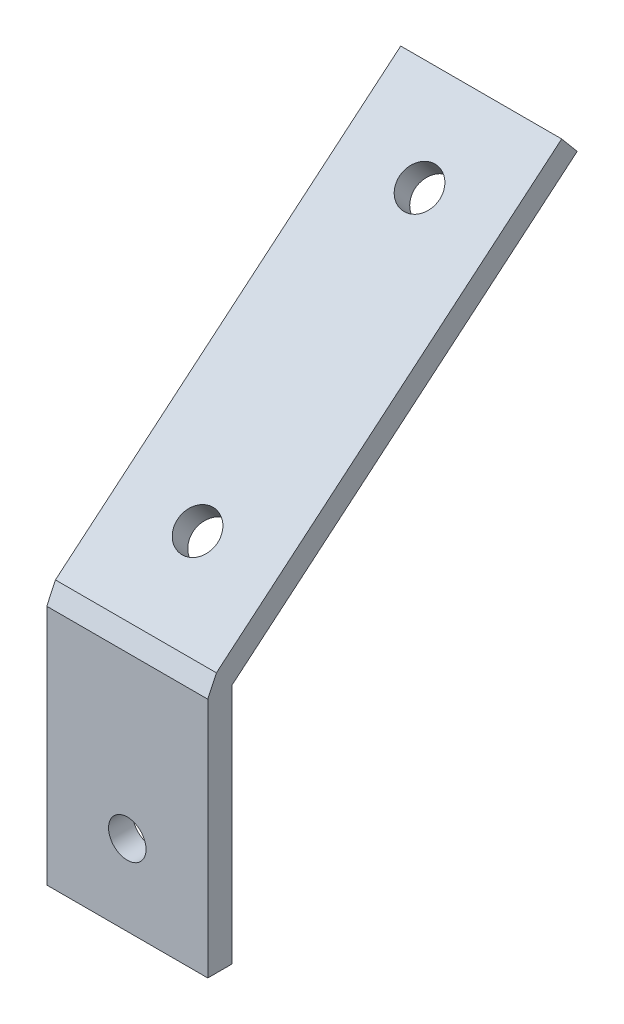
ISO-10303-21;
HEADER;
FILE_DESCRIPTION(('STEP AP214'),'2;1');
FILE_NAME('part.step','',(''),(''),'','','');
FILE_SCHEMA(('AUTOMOTIVE_DESIGN { 1 0 10303 214 1 1 1 1 }'));
ENDSEC;
DATA;
#1=APPLICATION_CONTEXT('core data for automotive mechanical design processes');
#2=APPLICATION_PROTOCOL_DEFINITION('international standard','automotive_design',2000,#1);
#3=PRODUCT_CONTEXT('',#1,'mechanical');
#4=PRODUCT('Part','Part','',(#3));
#5=PRODUCT_RELATED_PRODUCT_CATEGORY('part','',(#4));
#6=PRODUCT_DEFINITION_FORMATION('','',#4);
#7=PRODUCT_DEFINITION_CONTEXT('part definition',#1,'design');
#8=PRODUCT_DEFINITION('design','',#6,#7);
#9=PRODUCT_DEFINITION_SHAPE('','',#8);
#10=(LENGTH_UNIT() NAMED_UNIT(*) SI_UNIT(.MILLI.,.METRE.));
#11=(NAMED_UNIT(*) PLANE_ANGLE_UNIT() SI_UNIT($,.RADIAN.));
#12=(NAMED_UNIT(*) SI_UNIT($,.STERADIAN.) SOLID_ANGLE_UNIT());
#13=UNCERTAINTY_MEASURE_WITH_UNIT(LENGTH_MEASURE(1.E-05),#10,'distance_accuracy_value','');
#14=(GEOMETRIC_REPRESENTATION_CONTEXT(3) GLOBAL_UNCERTAINTY_ASSIGNED_CONTEXT((#13)) GLOBAL_UNIT_ASSIGNED_CONTEXT((#10,
#11,#12)) REPRESENTATION_CONTEXT('',''));
#15=CARTESIAN_POINT('',(0.,0.,0.));
#16=DIRECTION('',(0.,0.,1.));
#17=DIRECTION('',(1.,0.,0.));
#18=AXIS2_PLACEMENT_3D('',#15,#16,#17);
#19=CARTESIAN_POINT('',(20.,16.1275110354849,13.5325885616836));
#20=DIRECTION('',(0.,0.766044443118962,0.642787609686558));
#21=DIRECTION('',(0.,-0.642787609686558,0.766044443118962));
#22=AXIS2_PLACEMENT_3D('',#19,#20,#21);
#23=PLANE('',#22);
#24=CARTESIAN_POINT('',(10.,59.5682300455817,-38.2380443834723));
#25=DIRECTION('',(0.,-0.766044443118962,-0.642787609686558));
#26=DIRECTION('',(0.,0.642787609686558,-0.766044443118962));
#27=AXIS2_PLACEMENT_3D('',#24,#25,#26);
#28=CIRCLE('',#27,2.5);
#29=CARTESIAN_POINT('',(10.,61.1751990697981,-40.1531554912697));
#30=VERTEX_POINT('',#29);
#31=EDGE_CURVE('E133',#30,#30,#28,.T.);
#32=ORIENTED_EDGE('',*,*,#31,.F.);
#33=EDGE_LOOP('',(#32));
#34=FACE_BOUND('',#33,.T.);
#35=CARTESIAN_POINT('',(10.,36.4278760968656,-10.6604444311896));
#36=DIRECTION('',(0.,-0.766044443118962,-0.642787609686558));
#37=DIRECTION('',(0.,0.642787609686558,-0.766044443118962));
#38=AXIS2_PLACEMENT_3D('',#35,#36,#37);
#39=CIRCLE('',#38,2.5);
#40=CARTESIAN_POINT('',(10.,38.034845121082,-12.575555538987));
#41=VERTEX_POINT('',#40);
#42=EDGE_CURVE('E168',#41,#41,#39,.T.);
#43=ORIENTED_EDGE('',*,*,#42,.F.);
#44=EDGE_LOOP('',(#43));
#45=FACE_BOUND('',#44,.T.);
#46=DIRECTION('',(0.,0.642787609686558,-0.766044443118962));
#47=VECTOR('',#46,1.);
#48=CARTESIAN_POINT('',(0.,16.1275110354849,13.5325885616836));
#49=LINE('',#48,#47);
#50=CARTESIAN_POINT('',(0.,30.,-3.00000000000001));
#51=VERTEX_POINT('',#50);
#52=CARTESIAN_POINT('',(0.,65.9961061424472,-45.8984888146619));
#53=VERTEX_POINT('',#52);
#54=EDGE_CURVE('E129',#51,#53,#49,.T.);
#55=ORIENTED_EDGE('',*,*,#54,.T.);
#56=DIRECTION('',(-1.,0.,0.));
#57=VECTOR('',#56,1.);
#58=CARTESIAN_POINT('',(20.,65.9961061424472,-45.8984888146619));
#59=LINE('',#58,#57);
#60=CARTESIAN_POINT('',(20.,65.9961061424472,-45.8984888146619));
#61=VERTEX_POINT('',#60);
#62=EDGE_CURVE('E11',#61,#53,#59,.T.);
#63=ORIENTED_EDGE('',*,*,#62,.F.);
#64=DIRECTION('',(0.,0.642787609686558,-0.766044443118962));
#65=VECTOR('',#64,1.);
#66=CARTESIAN_POINT('',(20.,16.1275110354849,13.5325885616836));
#67=LINE('',#66,#65);
#68=CARTESIAN_POINT('',(20.,30.,-3.00000000000001));
#69=VERTEX_POINT('',#68);
#70=EDGE_CURVE('E145',#69,#61,#67,.T.);
#71=ORIENTED_EDGE('',*,*,#70,.F.);
#72=DIRECTION('',(-1.,0.,0.));
#73=VECTOR('',#72,1.);
#74=CARTESIAN_POINT('',(20.,30.,-3.00000000000001));
#75=LINE('',#74,#73);
#76=EDGE_CURVE('E128',#69,#51,#75,.T.);
#77=ORIENTED_EDGE('',*,*,#76,.T.);
#78=EDGE_LOOP('',(#55,#63,#71,#77));
#79=FACE_BOUND('',#78,.T.);
#80=ADVANCED_FACE('F37',(#34,#45,#79),#23,.F.);
#81=CARTESIAN_POINT('',(20.,49.8685951069621,-59.4310773763456));
#82=DIRECTION('',(0.,-0.642787609686555,0.766044443118965));
#83=DIRECTION('',(0.,-0.766044443118965,-0.642787609686555));
#84=AXIS2_PLACEMENT_3D('',#81,#82,#83);
#85=PLANE('',#84);
#86=DIRECTION('',(0.,0.766044443118965,0.642787609686555));
#87=VECTOR('',#86,1.);
#88=CARTESIAN_POINT('',(0.,49.8685951069621,-59.4310773763456));
#89=LINE('',#88,#87);
#90=CARTESIAN_POINT('',(0.,68.2942394718041,-43.9701259856022));
#91=VERTEX_POINT('',#90);
#92=EDGE_CURVE('E132',#53,#91,#89,.T.);
#93=ORIENTED_EDGE('',*,*,#92,.T.);
#94=DIRECTION('',(-1.,0.,0.));
#95=VECTOR('',#94,1.);
#96=CARTESIAN_POINT('',(20.,68.2942394718041,-43.9701259856022));
#97=LINE('',#96,#95);
#98=CARTESIAN_POINT('',(20.,68.2942394718041,-43.9701259856022));
#99=VERTEX_POINT('',#98);
#100=EDGE_CURVE('E45',#99,#91,#97,.T.);
#101=ORIENTED_EDGE('',*,*,#100,.F.);
#102=DIRECTION('',(0.,0.766044443118965,0.642787609686555));
#103=VECTOR('',#102,1.);
#104=CARTESIAN_POINT('',(20.,49.8685951069621,-59.4310773763456));
#105=LINE('',#104,#103);
#106=EDGE_CURVE('E92',#61,#99,#105,.T.);
#107=ORIENTED_EDGE('',*,*,#106,.F.);
#108=ORIENTED_EDGE('',*,*,#62,.T.);
#109=EDGE_LOOP('',(#93,#101,#107,#108));
#110=FACE_BOUND('',#109,.T.);
#111=ADVANCED_FACE('F154',(#110),#85,.F.);
#112=CARTESIAN_POINT('',(20.,18.4256443648418,15.4609513907432));
#113=DIRECTION('',(0.,0.766044443118962,0.642787609686558));
#114=DIRECTION('',(0.,-0.642787609686558,0.766044443118962));
#115=AXIS2_PLACEMENT_3D('',#112,#113,#114);
#116=PLANE('',#115);
#117=CARTESIAN_POINT('',(10.,61.8663633749386,-36.3096815544126));
#118=DIRECTION('',(0.,0.766044443118962,0.642787609686558));
#119=DIRECTION('',(0.,-0.642787609686558,0.766044443118962));
#120=AXIS2_PLACEMENT_3D('',#117,#118,#119);
#121=CIRCLE('',#120,2.5);
#122=CARTESIAN_POINT('',(10.,60.2593943507222,-34.3945704466152));
#123=VERTEX_POINT('',#122);
#124=EDGE_CURVE('E172',#123,#123,#121,.F.);
#125=ORIENTED_EDGE('',*,*,#124,.T.);
#126=EDGE_LOOP('',(#125));
#127=FACE_BOUND('',#126,.T.);
#128=CARTESIAN_POINT('',(10.,38.7260094262225,-8.73208160212995));
#129=DIRECTION('',(0.,0.766044443118962,0.642787609686558));
#130=DIRECTION('',(0.,-0.642787609686558,0.766044443118962));
#131=AXIS2_PLACEMENT_3D('',#128,#129,#130);
#132=CIRCLE('',#131,2.5);
#133=CARTESIAN_POINT('',(10.,37.1190404020061,-6.81697049433254));
#134=VERTEX_POINT('',#133);
#135=EDGE_CURVE('E165',#134,#134,#132,.F.);
#136=ORIENTED_EDGE('',*,*,#135,.T.);
#137=EDGE_LOOP('',(#136));
#138=FACE_BOUND('',#137,.T.);
#139=DIRECTION('',(0.,0.642787609686558,-0.766044443118963));
#140=VECTOR('',#139,1.);
#141=CARTESIAN_POINT('',(0.,18.4256443648418,15.4609513907432));
#142=LINE('',#141,#140);
#143=CARTESIAN_POINT('',(0.,32.2981333293569,-1.07163717094033));
#144=VERTEX_POINT('',#143);
#145=EDGE_CURVE('E136',#144,#91,#142,.T.);
#146=ORIENTED_EDGE('',*,*,#145,.F.);
#147=DIRECTION('',(-1.,0.,0.));
#148=VECTOR('',#147,1.);
#149=CARTESIAN_POINT('',(20.,32.2981333293569,-1.07163717094033));
#150=LINE('',#149,#148);
#151=CARTESIAN_POINT('',(20.,32.2981333293569,-1.07163717094033));
#152=VERTEX_POINT('',#151);
#153=EDGE_CURVE('E149',#152,#144,#150,.T.);
#154=ORIENTED_EDGE('',*,*,#153,.F.);
#155=DIRECTION('',(0.,0.642787609686558,-0.766044443118963));
#156=VECTOR('',#155,1.);
#157=CARTESIAN_POINT('',(20.,18.4256443648418,15.4609513907432));
#158=LINE('',#157,#156);
#159=EDGE_CURVE('E123',#152,#99,#158,.T.);
#160=ORIENTED_EDGE('',*,*,#159,.T.);
#161=ORIENTED_EDGE('',*,*,#100,.T.);
#162=EDGE_LOOP('',(#146,#154,#160,#161));
#163=FACE_BOUND('',#162,.T.);
#164=ADVANCED_FACE('F153',(#127,#138,#163),#116,.T.);
#165=CARTESIAN_POINT('',(20.,5.35818585470161,11.4906666467844));
#166=DIRECTION('',(0.,-0.422618261740688,-0.906307787036656));
#167=DIRECTION('',(0.,0.906307787036656,-0.422618261740688));
#168=AXIS2_PLACEMENT_3D('',#165,#166,#167);
#169=PLANE('',#168);
#170=DIRECTION('',(0.,-0.906307787036655,0.422618261740688));
#171=VECTOR('',#170,1.);
#172=CARTESIAN_POINT('',(0.,5.35818585470161,11.4906666467844));
#173=LINE('',#172,#171);
#174=CARTESIAN_POINT('',(0.,30.,0.));
#175=VERTEX_POINT('',#174);
#176=EDGE_CURVE('E139',#144,#175,#173,.T.);
#177=ORIENTED_EDGE('',*,*,#176,.T.);
#178=DIRECTION('',(-1.,0.,0.));
#179=VECTOR('',#178,1.);
#180=CARTESIAN_POINT('',(20.,30.,0.));
#181=LINE('',#180,#179);
#182=CARTESIAN_POINT('',(20.,30.,0.));
#183=VERTEX_POINT('',#182);
#184=EDGE_CURVE('E111',#183,#175,#181,.T.);
#185=ORIENTED_EDGE('',*,*,#184,.F.);
#186=DIRECTION('',(0.,-0.906307787036655,0.422618261740688));
#187=VECTOR('',#186,1.);
#188=CARTESIAN_POINT('',(20.,5.35818585470161,11.4906666467844));
#189=LINE('',#188,#187);
#190=EDGE_CURVE('E120',#152,#183,#189,.T.);
#191=ORIENTED_EDGE('',*,*,#190,.F.);
#192=ORIENTED_EDGE('',*,*,#153,.T.);
#193=EDGE_LOOP('',(#177,#185,#191,#192));
#194=FACE_BOUND('',#193,.T.);
#195=ADVANCED_FACE('F161',(#194),#169,.F.);
#196=CARTESIAN_POINT('',(20.,0.,0.));
#197=DIRECTION('',(0.,0.,1.));
#198=DIRECTION('',(1.,0.,0.));
#199=AXIS2_PLACEMENT_3D('',#196,#197,#198);
#200=PLANE('',#199);
#201=CARTESIAN_POINT('',(10.,10.,0.));
#202=DIRECTION('',(0.,0.,1.));
#203=DIRECTION('',(1.,0.,0.));
#204=AXIS2_PLACEMENT_3D('',#201,#202,#203);
#205=CIRCLE('',#204,2.32874920474636);
#206=CARTESIAN_POINT('',(12.3287492047464,10.,0.));
#207=VERTEX_POINT('',#206);
#208=EDGE_CURVE('E169',#207,#207,#205,.T.);
#209=ORIENTED_EDGE('',*,*,#208,.F.);
#210=EDGE_LOOP('',(#209));
#211=FACE_BOUND('',#210,.T.);
#212=DIRECTION('',(0.,1.,0.));
#213=VECTOR('',#212,1.);
#214=CARTESIAN_POINT('',(0.,0.,0.));
#215=LINE('',#214,#213);
#216=CARTESIAN_POINT('',(0.,0.,0.));
#217=VERTEX_POINT('',#216);
#218=EDGE_CURVE('E110',#217,#175,#215,.T.);
#219=ORIENTED_EDGE('',*,*,#218,.F.);
#220=DIRECTION('',(-1.,0.,0.));
#221=VECTOR('',#220,1.);
#222=CARTESIAN_POINT('',(20.,0.,0.));
#223=LINE('',#222,#221);
#224=CARTESIAN_POINT('',(20.,0.,0.));
#225=VERTEX_POINT('',#224);
#226=EDGE_CURVE('E104',#225,#217,#223,.T.);
#227=ORIENTED_EDGE('',*,*,#226,.F.);
#228=DIRECTION('',(0.,1.,0.));
#229=VECTOR('',#228,1.);
#230=CARTESIAN_POINT('',(20.,0.,0.));
#231=LINE('',#230,#229);
#232=EDGE_CURVE('E108',#225,#183,#231,.T.);
#233=ORIENTED_EDGE('',*,*,#232,.T.);
#234=ORIENTED_EDGE('',*,*,#184,.T.);
#235=EDGE_LOOP('',(#219,#227,#233,#234));
#236=FACE_BOUND('',#235,.T.);
#237=ADVANCED_FACE('F106',(#211,#236),#200,.T.);
#238=CARTESIAN_POINT('',(20.,0.,0.));
#239=DIRECTION('',(0.,1.,0.));
#240=DIRECTION('',(0.,0.,1.));
#241=AXIS2_PLACEMENT_3D('',#238,#239,#240);
#242=PLANE('',#241);
#243=DIRECTION('',(0.,0.,-1.));
#244=VECTOR('',#243,1.);
#245=CARTESIAN_POINT('',(0.,0.,0.));
#246=LINE('',#245,#244);
#247=CARTESIAN_POINT('',(0.,0.,-3.));
#248=VERTEX_POINT('',#247);
#249=EDGE_CURVE('E78',#217,#248,#246,.T.);
#250=ORIENTED_EDGE('',*,*,#249,.T.);
#251=DIRECTION('',(-1.,0.,0.));
#252=VECTOR('',#251,1.);
#253=CARTESIAN_POINT('',(20.,0.,-3.));
#254=LINE('',#253,#252);
#255=CARTESIAN_POINT('',(20.,0.,-3.));
#256=VERTEX_POINT('',#255);
#257=EDGE_CURVE('E112',#256,#248,#254,.T.);
#258=ORIENTED_EDGE('',*,*,#257,.F.);
#259=DIRECTION('',(0.,0.,-1.));
#260=VECTOR('',#259,1.);
#261=CARTESIAN_POINT('',(20.,0.,0.));
#262=LINE('',#261,#260);
#263=EDGE_CURVE('E114',#225,#256,#262,.T.);
#264=ORIENTED_EDGE('',*,*,#263,.F.);
#265=ORIENTED_EDGE('',*,*,#226,.T.);
#266=EDGE_LOOP('',(#250,#258,#264,#265));
#267=FACE_BOUND('',#266,.T.);
#268=ADVANCED_FACE('F115',(#267),#242,.F.);
#269=CARTESIAN_POINT('',(20.,0.,-3.));
#270=DIRECTION('',(0.,0.,1.));
#271=DIRECTION('',(1.,0.,0.));
#272=AXIS2_PLACEMENT_3D('',#269,#270,#271);
#273=PLANE('',#272);
#274=CARTESIAN_POINT('',(10.,10.,-3.));
#275=DIRECTION('',(0.,0.,-1.));
#276=DIRECTION('',(-1.,0.,0.));
#277=AXIS2_PLACEMENT_3D('',#274,#275,#276);
#278=CIRCLE('',#277,2.32874920474636);
#279=CARTESIAN_POINT('',(7.67125079525364,10.,-3.));
#280=VERTEX_POINT('',#279);
#281=EDGE_CURVE('E179',#280,#280,#278,.T.);
#282=ORIENTED_EDGE('',*,*,#281,.F.);
#283=EDGE_LOOP('',(#282));
#284=FACE_BOUND('',#283,.T.);
#285=DIRECTION('',(0.,1.,0.));
#286=VECTOR('',#285,1.);
#287=CARTESIAN_POINT('',(0.,0.,-3.));
#288=LINE('',#287,#286);
#289=EDGE_CURVE('E84',#248,#51,#288,.T.);
#290=ORIENTED_EDGE('',*,*,#289,.T.);
#291=ORIENTED_EDGE('',*,*,#76,.F.);
#292=DIRECTION('',(0.,1.,0.));
#293=VECTOR('',#292,1.);
#294=CARTESIAN_POINT('',(20.,0.,-3.));
#295=LINE('',#294,#293);
#296=EDGE_CURVE('E53',#256,#69,#295,.T.);
#297=ORIENTED_EDGE('',*,*,#296,.F.);
#298=ORIENTED_EDGE('',*,*,#257,.T.);
#299=EDGE_LOOP('',(#290,#291,#297,#298));
#300=FACE_BOUND('',#299,.T.);
#301=ADVANCED_FACE('F185',(#284,#300),#273,.F.);
#302=CARTESIAN_POINT('',(20.,0.,0.));
#303=DIRECTION('',(1.,0.,0.));
#304=DIRECTION('',(0.,0.,-1.));
#305=AXIS2_PLACEMENT_3D('',#302,#303,#304);
#306=PLANE('',#305);
#307=ORIENTED_EDGE('',*,*,#70,.T.);
#308=ORIENTED_EDGE('',*,*,#106,.T.);
#309=ORIENTED_EDGE('',*,*,#159,.F.);
#310=ORIENTED_EDGE('',*,*,#190,.T.);
#311=ORIENTED_EDGE('',*,*,#232,.F.);
#312=ORIENTED_EDGE('',*,*,#263,.T.);
#313=ORIENTED_EDGE('',*,*,#296,.T.);
#314=EDGE_LOOP('',(#307,#308,#309,#310,#311,#312,#313));
#315=FACE_BOUND('',#314,.T.);
#316=ADVANCED_FACE('F117',(#315),#306,.T.);
#317=CARTESIAN_POINT('',(0.,0.,0.));
#318=DIRECTION('',(1.,0.,0.));
#319=DIRECTION('',(0.,0.,-1.));
#320=AXIS2_PLACEMENT_3D('',#317,#318,#319);
#321=PLANE('',#320);
#322=ORIENTED_EDGE('',*,*,#54,.F.);
#323=ORIENTED_EDGE('',*,*,#289,.F.);
#324=ORIENTED_EDGE('',*,*,#249,.F.);
#325=ORIENTED_EDGE('',*,*,#218,.T.);
#326=ORIENTED_EDGE('',*,*,#176,.F.);
#327=ORIENTED_EDGE('',*,*,#145,.T.);
#328=ORIENTED_EDGE('',*,*,#92,.F.);
#329=EDGE_LOOP('',(#322,#323,#324,#325,#326,#327,#328));
#330=FACE_BOUND('',#329,.T.);
#331=ADVANCED_FACE('F159',(#330),#321,.F.);
#332=CARTESIAN_POINT('',(10.,60.3781491399603,9.4362208458673));
#333=DIRECTION('',(0.,-0.766044443118962,-0.642787609686558));
#334=DIRECTION('',(0.,0.642787609686558,-0.766044443118962));
#335=AXIS2_PLACEMENT_3D('',#332,#333,#334);
#336=CYLINDRICAL_SURFACE('',#335,2.5);
#337=ORIENTED_EDGE('',*,*,#135,.F.);
#338=EDGE_LOOP('',(#337));
#339=FACE_BOUND('',#338,.T.);
#340=ORIENTED_EDGE('',*,*,#42,.T.);
#341=EDGE_LOOP('',(#340));
#342=FACE_BOUND('',#341,.T.);
#343=ADVANCED_FACE('F206',(#339,#342),#336,.F.);
#344=CARTESIAN_POINT('',(10.,83.5185030886764,-18.1413791064153));
#345=DIRECTION('',(0.,-0.766044443118962,-0.642787609686558));
#346=DIRECTION('',(0.,0.642787609686558,-0.766044443118962));
#347=AXIS2_PLACEMENT_3D('',#344,#345,#346);
#348=CYLINDRICAL_SURFACE('',#347,2.5);
#349=ORIENTED_EDGE('',*,*,#124,.F.);
#350=EDGE_LOOP('',(#349));
#351=FACE_BOUND('',#350,.T.);
#352=ORIENTED_EDGE('',*,*,#31,.T.);
#353=EDGE_LOOP('',(#352));
#354=FACE_BOUND('',#353,.T.);
#355=ADVANCED_FACE('F208',(#351,#354),#348,.F.);
#356=CARTESIAN_POINT('',(10.,10.,97.));
#357=DIRECTION('',(0.,0.,-1.));
#358=DIRECTION('',(-1.,0.,0.));
#359=AXIS2_PLACEMENT_3D('',#356,#357,#358);
#360=CYLINDRICAL_SURFACE('',#359,2.32874920474636);
#361=ORIENTED_EDGE('',*,*,#208,.T.);
#362=EDGE_LOOP('',(#361));
#363=FACE_BOUND('',#362,.T.);
#364=ORIENTED_EDGE('',*,*,#281,.T.);
#365=EDGE_LOOP('',(#364));
#366=FACE_BOUND('',#365,.T.);
#367=ADVANCED_FACE('F183',(#363,#366),#360,.F.);
#368=CLOSED_SHELL('',(#80,#111,#164,#195,#237,#268,#301,#316,#331,#343,#355,#367));
#369=MANIFOLD_SOLID_BREP('B2',#368);
#370=ADVANCED_BREP_SHAPE_REPRESENTATION('',(#18,#369),#14);
#371=SHAPE_DEFINITION_REPRESENTATION(#9,#370);
ENDSEC;
END-ISO-10303-21;
